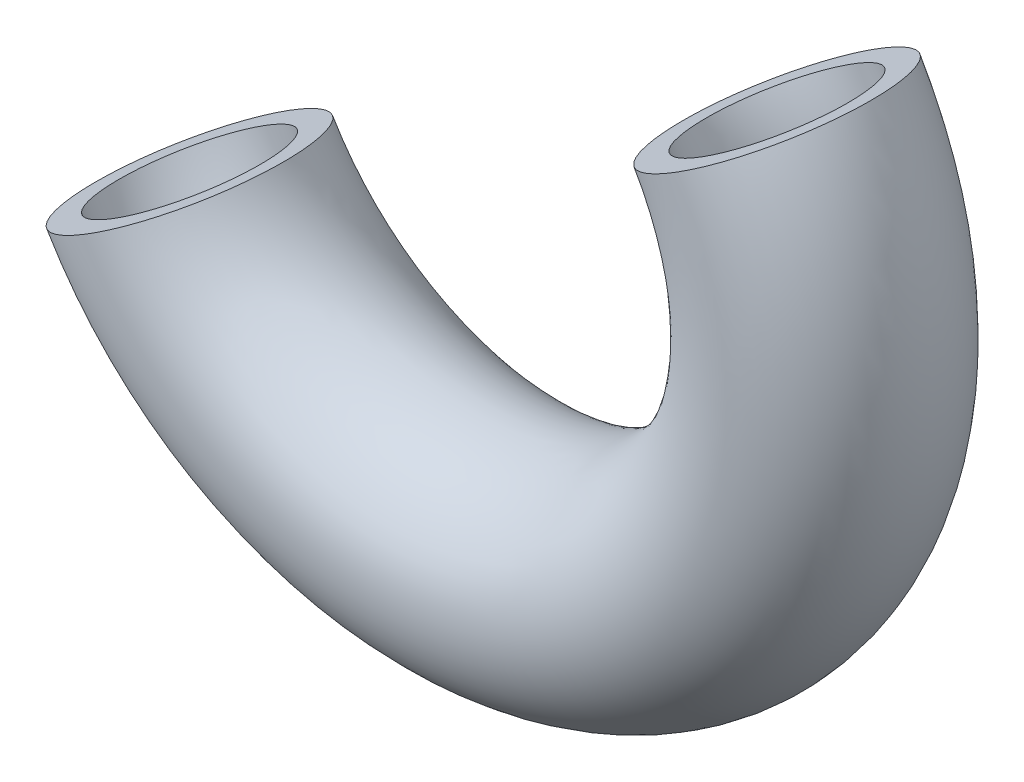
ISO-10303-21;
HEADER;
FILE_DESCRIPTION(('STEP AP214'),'2;1');
FILE_NAME('part.step','',(''),(''),'','','');
FILE_SCHEMA(('AUTOMOTIVE_DESIGN { 1 0 10303 214 1 1 1 1 }'));
ENDSEC;
DATA;
#1=APPLICATION_CONTEXT('core data for automotive mechanical design processes');
#2=APPLICATION_PROTOCOL_DEFINITION('international standard','automotive_design',2000,#1);
#3=PRODUCT_CONTEXT('',#1,'mechanical');
#4=PRODUCT('Part','Part','',(#3));
#5=PRODUCT_RELATED_PRODUCT_CATEGORY('part','',(#4));
#6=PRODUCT_DEFINITION_FORMATION('','',#4);
#7=PRODUCT_DEFINITION_CONTEXT('part definition',#1,'design');
#8=PRODUCT_DEFINITION('design','',#6,#7);
#9=PRODUCT_DEFINITION_SHAPE('','',#8);
#10=(LENGTH_UNIT() NAMED_UNIT(*) SI_UNIT(.MILLI.,.METRE.));
#11=(NAMED_UNIT(*) PLANE_ANGLE_UNIT() SI_UNIT($,.RADIAN.));
#12=(NAMED_UNIT(*) SI_UNIT($,.STERADIAN.) SOLID_ANGLE_UNIT());
#13=UNCERTAINTY_MEASURE_WITH_UNIT(LENGTH_MEASURE(1.E-05),#10,'distance_accuracy_value','');
#14=(GEOMETRIC_REPRESENTATION_CONTEXT(3) GLOBAL_UNCERTAINTY_ASSIGNED_CONTEXT((#13)) GLOBAL_UNIT_ASSIGNED_CONTEXT((#10,
#11,#12)) REPRESENTATION_CONTEXT('',''));
#15=CARTESIAN_POINT('',(0.,0.,0.));
#16=DIRECTION('',(0.,0.,1.));
#17=DIRECTION('',(1.,0.,0.));
#18=AXIS2_PLACEMENT_3D('',#15,#16,#17);
#19=CARTESIAN_POINT('',(0.,0.,0.));
#20=DIRECTION('',(0.508594385566468,-0.861006243281817,0.));
#21=DIRECTION('',(0.861006243281817,0.508594385566468,0.));
#22=AXIS2_PLACEMENT_3D('',#19,#20,#21);
#23=PLANE('',#22);
#24=CARTESIAN_POINT('',(0.,0.,0.));
#25=DIRECTION('',(0.508594385566468,-0.861006243281817,0.));
#26=DIRECTION('',(0.861006243281817,0.508594385566468,0.));
#27=AXIS2_PLACEMENT_3D('',#24,#25,#26);
#28=CIRCLE('',#27,3.);
#29=CARTESIAN_POINT('',(-2.58301872984545,-1.5257831566994,0.));
#30=VERTEX_POINT('',#29);
#31=EDGE_CURVE('E52',#30,#30,#28,.T.);
#32=ORIENTED_EDGE('',*,*,#31,.T.);
#33=EDGE_LOOP('',(#32));
#34=FACE_BOUND('',#33,.T.);
#35=CARTESIAN_POINT('',(0.,0.,0.));
#36=DIRECTION('',(0.508594385566468,-0.861006243281817,0.));
#37=DIRECTION('',(0.861006243281817,0.508594385566468,0.));
#38=AXIS2_PLACEMENT_3D('',#35,#36,#37);
#39=CIRCLE('',#38,3.98);
#40=CARTESIAN_POINT('',(-3.42680484826163,-2.02420565455454,0.));
#41=VERTEX_POINT('',#40);
#42=EDGE_CURVE('E41',#41,#41,#39,.T.);
#43=ORIENTED_EDGE('',*,*,#42,.F.);
#44=EDGE_LOOP('',(#43));
#45=FACE_BOUND('',#44,.T.);
#46=ADVANCED_FACE('F37',(#34,#45),#23,.F.);
#47=CARTESIAN_POINT('',(21.5,12.7,0.));
#48=DIRECTION('',(-0.508594385566468,0.861006243281817,0.));
#49=DIRECTION('',(-0.861006243281817,-0.508594385566468,0.));
#50=AXIS2_PLACEMENT_3D('',#47,#48,#49);
#51=PLANE('',#50);
#52=CARTESIAN_POINT('',(21.5,12.7,0.));
#53=DIRECTION('',(-0.508594385566468,0.861006243281817,0.));
#54=DIRECTION('',(-0.861006243281817,-0.508594385566468,0.));
#55=AXIS2_PLACEMENT_3D('',#52,#53,#54);
#56=CIRCLE('',#55,3.);
#57=CARTESIAN_POINT('',(24.0830187298454,14.2257831566994,0.));
#58=VERTEX_POINT('',#57);
#59=EDGE_CURVE('E48',#58,#58,#56,.T.);
#60=ORIENTED_EDGE('',*,*,#59,.F.);
#61=EDGE_LOOP('',(#60));
#62=FACE_BOUND('',#61,.T.);
#63=CARTESIAN_POINT('',(21.5,12.7,0.));
#64=DIRECTION('',(-0.508594385566468,0.861006243281817,0.));
#65=DIRECTION('',(-0.861006243281817,-0.508594385566468,0.));
#66=AXIS2_PLACEMENT_3D('',#63,#64,#65);
#67=CIRCLE('',#66,3.98);
#68=CARTESIAN_POINT('',(24.9268048482616,14.7242056545545,0.));
#69=VERTEX_POINT('',#68);
#70=EDGE_CURVE('E11',#69,#69,#67,.T.);
#71=ORIENTED_EDGE('',*,*,#70,.T.);
#72=EDGE_LOOP('',(#71));
#73=FACE_BOUND('',#72,.T.);
#74=ADVANCED_FACE('F65',(#62,#73),#51,.T.);
#75=CARTESIAN_POINT('',(10.75,6.35,0.));
#76=DIRECTION('',(0.,0.,1.));
#77=DIRECTION('',(1.,0.,0.));
#78=AXIS2_PLACEMENT_3D('',#75,#76,#77);
#79=TOROIDAL_SURFACE('',#78,12.4853914636266,3.98);
#80=CARTESIAN_POINT('',(10.75,6.35,0.));
#81=DIRECTION('',(0.,0.,1.));
#82=DIRECTION('',(1.,0.,0.));
#83=AXIS2_PLACEMENT_3D('',#80,#81,#82);
#84=CIRCLE('',#83,16.4653914636266);
#85=EDGE_CURVE('',#41,#69,#84,.T.);
#86=ORIENTED_EDGE('',*,*,#42,.T.);
#87=ORIENTED_EDGE('',*,*,#70,.F.);
#88=ORIENTED_EDGE('',*,*,#85,.T.);
#89=ORIENTED_EDGE('',*,*,#85,.F.);
#90=EDGE_LOOP('',(#86,#88,#87,#89));
#91=FACE_BOUND('',#90,.T.);
#92=ADVANCED_FACE('F39',(#91),#79,.T.);
#93=CARTESIAN_POINT('',(10.75,6.35,0.));
#94=DIRECTION('',(0.,0.,1.));
#95=DIRECTION('',(1.,0.,0.));
#96=AXIS2_PLACEMENT_3D('',#93,#94,#95);
#97=TOROIDAL_SURFACE('',#96,12.4853914636266,3.);
#98=CARTESIAN_POINT('',(10.75,6.35,0.));
#99=DIRECTION('',(0.,0.,1.));
#100=DIRECTION('',(1.,0.,0.));
#101=AXIS2_PLACEMENT_3D('',#98,#99,#100);
#102=CIRCLE('',#101,15.4853914636266);
#103=EDGE_CURVE('',#30,#58,#102,.T.);
#104=ORIENTED_EDGE('',*,*,#31,.F.);
#105=ORIENTED_EDGE('',*,*,#59,.T.);
#106=ORIENTED_EDGE('',*,*,#103,.T.);
#107=ORIENTED_EDGE('',*,*,#103,.F.);
#108=EDGE_LOOP('',(#104,#106,#105,#107));
#109=FACE_BOUND('',#108,.T.);
#110=ADVANCED_FACE('F58',(#109),#97,.F.);
#111=CLOSED_SHELL('',(#46,#74,#92,#110));
#112=MANIFOLD_SOLID_BREP('B2',#111);
#113=ADVANCED_BREP_SHAPE_REPRESENTATION('',(#18,#112),#14);
#114=SHAPE_DEFINITION_REPRESENTATION(#9,#113);
ENDSEC;
END-ISO-10303-21;
